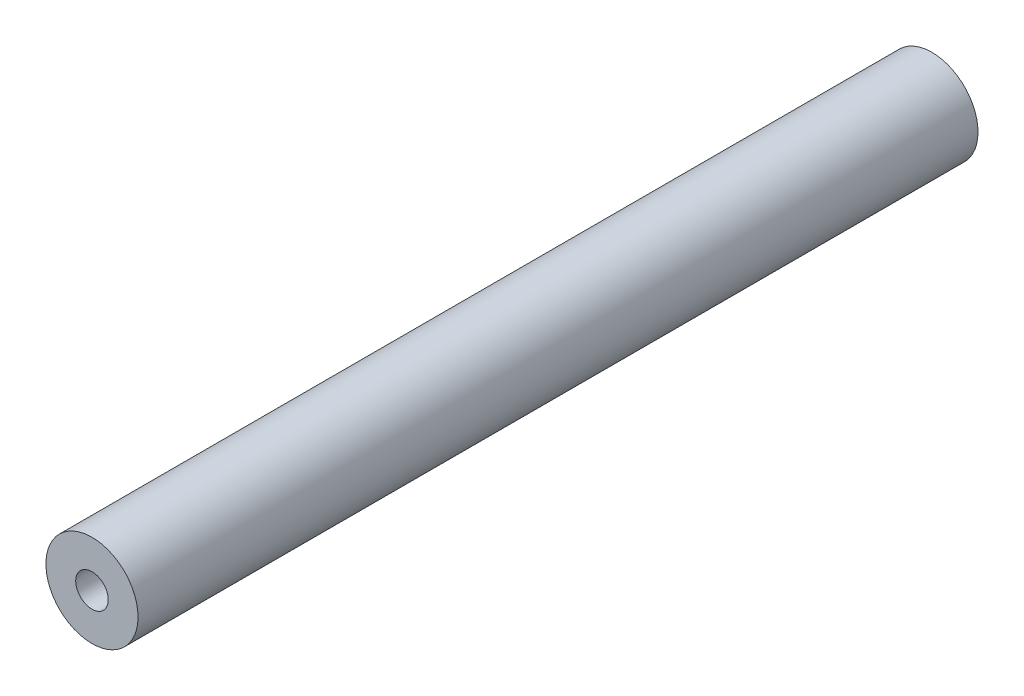
ISO-10303-21;
HEADER;
FILE_DESCRIPTION(('STEP AP214'),'2;1');
FILE_NAME('part.step','',(''),(''),'','','');
FILE_SCHEMA(('AUTOMOTIVE_DESIGN { 1 0 10303 214 1 1 1 1 }'));
ENDSEC;
DATA;
#1=APPLICATION_CONTEXT('core data for automotive mechanical design processes');
#2=APPLICATION_PROTOCOL_DEFINITION('international standard','automotive_design',2000,#1);
#3=PRODUCT_CONTEXT('',#1,'mechanical');
#4=PRODUCT('Part','Part','',(#3));
#5=PRODUCT_RELATED_PRODUCT_CATEGORY('part','',(#4));
#6=PRODUCT_DEFINITION_FORMATION('','',#4);
#7=PRODUCT_DEFINITION_CONTEXT('part definition',#1,'design');
#8=PRODUCT_DEFINITION('design','',#6,#7);
#9=PRODUCT_DEFINITION_SHAPE('','',#8);
#10=(LENGTH_UNIT() NAMED_UNIT(*) SI_UNIT(.MILLI.,.METRE.));
#11=(NAMED_UNIT(*) PLANE_ANGLE_UNIT() SI_UNIT($,.RADIAN.));
#12=(NAMED_UNIT(*) SI_UNIT($,.STERADIAN.) SOLID_ANGLE_UNIT());
#13=UNCERTAINTY_MEASURE_WITH_UNIT(LENGTH_MEASURE(1.E-05),#10,'distance_accuracy_value','');
#14=(GEOMETRIC_REPRESENTATION_CONTEXT(3) GLOBAL_UNCERTAINTY_ASSIGNED_CONTEXT((#13)) GLOBAL_UNIT_ASSIGNED_CONTEXT((#10,
#11,#12)) REPRESENTATION_CONTEXT('',''));
#15=CARTESIAN_POINT('',(0.,0.,0.));
#16=DIRECTION('',(0.,0.,1.));
#17=DIRECTION('',(1.,0.,0.));
#18=AXIS2_PLACEMENT_3D('',#15,#16,#17);
#19=CARTESIAN_POINT('',(0.,0.,80.));
#20=DIRECTION('',(0.,0.,1.));
#21=DIRECTION('',(1.,0.,0.));
#22=AXIS2_PLACEMENT_3D('',#19,#20,#21);
#23=PLANE('',#22);
#24=CARTESIAN_POINT('',(0.,0.,80.));
#25=DIRECTION('',(0.,0.,1.));
#26=DIRECTION('',(1.,0.,0.));
#27=AXIS2_PLACEMENT_3D('',#24,#25,#26);
#28=CIRCLE('',#27,8.5);
#29=CARTESIAN_POINT('',(8.5,0.,80.));
#30=VERTEX_POINT('',#29);
#31=EDGE_CURVE('E10',#30,#30,#28,.T.);
#32=ORIENTED_EDGE('',*,*,#31,.T.);
#33=EDGE_LOOP('',(#32));
#34=FACE_BOUND('',#33,.T.);
#35=CARTESIAN_POINT('',(0.,0.,80.));
#36=DIRECTION('',(0.,0.,1.));
#37=DIRECTION('',(1.,0.,0.));
#38=AXIS2_PLACEMENT_3D('',#35,#36,#37);
#39=CIRCLE('',#38,3.);
#40=CARTESIAN_POINT('',(3.,0.,80.));
#41=VERTEX_POINT('',#40);
#42=EDGE_CURVE('E49',#41,#41,#39,.T.);
#43=ORIENTED_EDGE('',*,*,#42,.F.);
#44=EDGE_LOOP('',(#43));
#45=FACE_BOUND('',#44,.T.);
#46=ADVANCED_FACE('F36',(#34,#45),#23,.T.);
#47=CARTESIAN_POINT('',(0.,0.,-75.));
#48=DIRECTION('',(0.,0.,1.));
#49=DIRECTION('',(1.,0.,0.));
#50=AXIS2_PLACEMENT_3D('',#47,#48,#49);
#51=PLANE('',#50);
#52=CARTESIAN_POINT('',(0.,0.,-75.));
#53=DIRECTION('',(0.,0.,1.));
#54=DIRECTION('',(1.,0.,0.));
#55=AXIS2_PLACEMENT_3D('',#52,#53,#54);
#56=CIRCLE('',#55,8.5);
#57=CARTESIAN_POINT('',(8.5,0.,-75.));
#58=VERTEX_POINT('',#57);
#59=EDGE_CURVE('E40',#58,#58,#56,.T.);
#60=ORIENTED_EDGE('',*,*,#59,.F.);
#61=EDGE_LOOP('',(#60));
#62=FACE_BOUND('',#61,.T.);
#63=CARTESIAN_POINT('',(0.,0.,-75.));
#64=DIRECTION('',(0.,0.,1.));
#65=DIRECTION('',(1.,0.,0.));
#66=AXIS2_PLACEMENT_3D('',#63,#64,#65);
#67=CIRCLE('',#66,3.);
#68=CARTESIAN_POINT('',(3.,0.,-75.));
#69=VERTEX_POINT('',#68);
#70=EDGE_CURVE('E51',#69,#69,#67,.T.);
#71=ORIENTED_EDGE('',*,*,#70,.T.);
#72=EDGE_LOOP('',(#71));
#73=FACE_BOUND('',#72,.T.);
#74=ADVANCED_FACE('F63',(#62,#73),#51,.F.);
#75=CARTESIAN_POINT('',(0.,0.,80.));
#76=DIRECTION('',(0.,0.,-1.));
#77=DIRECTION('',(-1.,0.,0.));
#78=AXIS2_PLACEMENT_3D('',#75,#76,#77);
#79=CYLINDRICAL_SURFACE('',#78,8.5);
#80=ORIENTED_EDGE('',*,*,#31,.F.);
#81=EDGE_LOOP('',(#80));
#82=FACE_BOUND('',#81,.T.);
#83=ORIENTED_EDGE('',*,*,#59,.T.);
#84=EDGE_LOOP('',(#83));
#85=FACE_BOUND('',#84,.T.);
#86=ADVANCED_FACE('F38',(#82,#85),#79,.T.);
#87=CARTESIAN_POINT('',(0.,0.,80.));
#88=DIRECTION('',(0.,0.,-1.));
#89=DIRECTION('',(-1.,0.,0.));
#90=AXIS2_PLACEMENT_3D('',#87,#88,#89);
#91=CYLINDRICAL_SURFACE('',#90,3.);
#92=ORIENTED_EDGE('',*,*,#42,.T.);
#93=EDGE_LOOP('',(#92));
#94=FACE_BOUND('',#93,.T.);
#95=ORIENTED_EDGE('',*,*,#70,.F.);
#96=EDGE_LOOP('',(#95));
#97=FACE_BOUND('',#96,.T.);
#98=ADVANCED_FACE('F59',(#94,#97),#91,.F.);
#99=CLOSED_SHELL('',(#46,#74,#86,#98));
#100=MANIFOLD_SOLID_BREP('B2',#99);
#101=ADVANCED_BREP_SHAPE_REPRESENTATION('',(#18,#100),#14);
#102=SHAPE_DEFINITION_REPRESENTATION(#9,#101);
ENDSEC;
END-ISO-10303-21;
